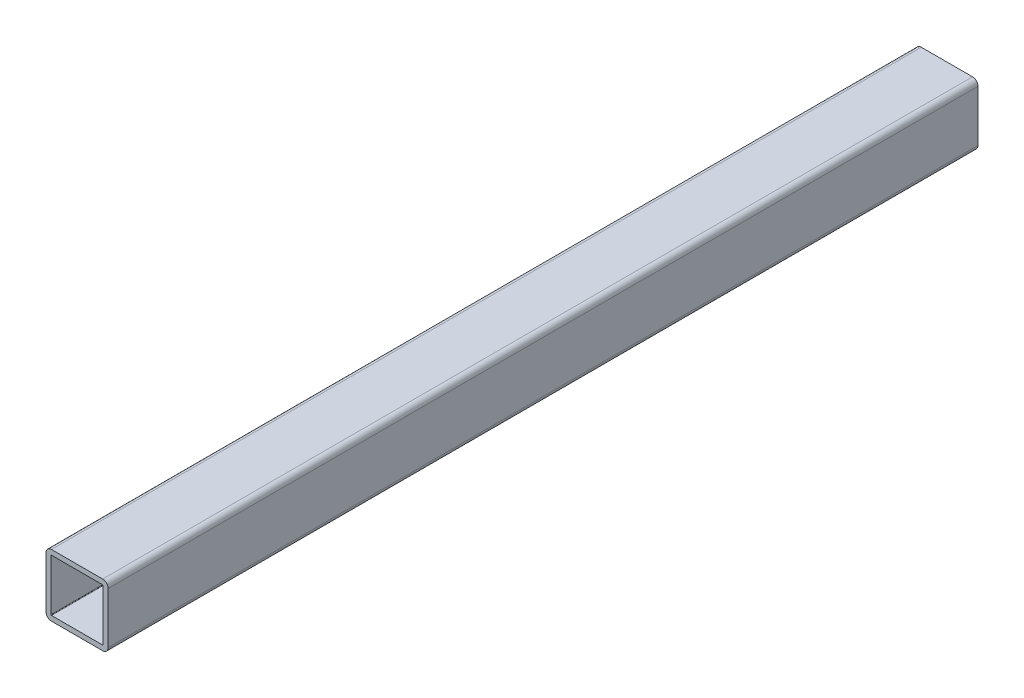
ISO-10303-21;
HEADER;
FILE_DESCRIPTION(('STEP AP214'),'2;1');
FILE_NAME('part.step','',(''),(''),'','','');
FILE_SCHEMA(('AUTOMOTIVE_DESIGN { 1 0 10303 214 1 1 1 1 }'));
ENDSEC;
DATA;
#1=APPLICATION_CONTEXT('core data for automotive mechanical design processes');
#2=APPLICATION_PROTOCOL_DEFINITION('international standard','automotive_design',2000,#1);
#3=PRODUCT_CONTEXT('',#1,'mechanical');
#4=PRODUCT('Part','Part','',(#3));
#5=PRODUCT_RELATED_PRODUCT_CATEGORY('part','',(#4));
#6=PRODUCT_DEFINITION_FORMATION('','',#4);
#7=PRODUCT_DEFINITION_CONTEXT('part definition',#1,'design');
#8=PRODUCT_DEFINITION('design','',#6,#7);
#9=PRODUCT_DEFINITION_SHAPE('','',#8);
#10=(LENGTH_UNIT() NAMED_UNIT(*) SI_UNIT(.MILLI.,.METRE.));
#11=(NAMED_UNIT(*) PLANE_ANGLE_UNIT() SI_UNIT($,.RADIAN.));
#12=(NAMED_UNIT(*) SI_UNIT($,.STERADIAN.) SOLID_ANGLE_UNIT());
#13=UNCERTAINTY_MEASURE_WITH_UNIT(LENGTH_MEASURE(1.E-05),#10,'distance_accuracy_value','');
#14=(GEOMETRIC_REPRESENTATION_CONTEXT(3) GLOBAL_UNCERTAINTY_ASSIGNED_CONTEXT((#13)) GLOBAL_UNIT_ASSIGNED_CONTEXT((#10,
#11,#12)) REPRESENTATION_CONTEXT('',''));
#15=CARTESIAN_POINT('',(0.,0.,0.));
#16=DIRECTION('',(0.,0.,1.));
#17=DIRECTION('',(1.,0.,0.));
#18=AXIS2_PLACEMENT_3D('',#15,#16,#17);
#19=CARTESIAN_POINT('',(-10.3,10.3,-350.));
#20=DIRECTION('',(0.,0.,1.));
#21=DIRECTION('',(1.,0.,0.));
#22=AXIS2_PLACEMENT_3D('',#19,#20,#21);
#23=CYLINDRICAL_SURFACE('',#22,2.2);
#24=CARTESIAN_POINT('',(-10.3,10.3,0.));
#25=DIRECTION('',(0.,0.,-1.));
#26=DIRECTION('',(-1.,0.,0.));
#27=AXIS2_PLACEMENT_3D('',#24,#25,#26);
#28=CIRCLE('',#27,2.2);
#29=CARTESIAN_POINT('',(-12.5,10.3,0.));
#30=VERTEX_POINT('',#29);
#31=CARTESIAN_POINT('',(-10.3,12.5,0.));
#32=VERTEX_POINT('',#31);
#33=EDGE_CURVE('E235',#30,#32,#28,.T.);
#34=ORIENTED_EDGE('',*,*,#33,.T.);
#35=DIRECTION('',(0.,0.,1.));
#36=VECTOR('',#35,1.);
#37=CARTESIAN_POINT('',(-10.3,12.5,-350.));
#38=LINE('',#37,#36);
#39=CARTESIAN_POINT('',(-10.3,12.5,-350.));
#40=VERTEX_POINT('',#39);
#41=EDGE_CURVE('E12',#40,#32,#38,.T.);
#42=ORIENTED_EDGE('',*,*,#41,.F.);
#43=CARTESIAN_POINT('',(-10.3,10.3,-350.));
#44=DIRECTION('',(0.,0.,-1.));
#45=DIRECTION('',(-1.,0.,0.));
#46=AXIS2_PLACEMENT_3D('',#43,#44,#45);
#47=CIRCLE('',#46,2.2);
#48=CARTESIAN_POINT('',(-12.5,10.3,-350.));
#49=VERTEX_POINT('',#48);
#50=EDGE_CURVE('E313',#49,#40,#47,.T.);
#51=ORIENTED_EDGE('',*,*,#50,.F.);
#52=DIRECTION('',(0.,0.,1.));
#53=VECTOR('',#52,1.);
#54=CARTESIAN_POINT('',(-12.5,10.3,-350.));
#55=LINE('',#54,#53);
#56=EDGE_CURVE('E250',#49,#30,#55,.T.);
#57=ORIENTED_EDGE('',*,*,#56,.T.);
#58=EDGE_LOOP('',(#34,#42,#51,#57));
#59=FACE_BOUND('',#58,.T.);
#60=ADVANCED_FACE('F63',(#59),#23,.T.);
#61=CARTESIAN_POINT('',(-10.3,12.5,-350.));
#62=DIRECTION('',(0.,-1.,0.));
#63=DIRECTION('',(0.,0.,-1.));
#64=AXIS2_PLACEMENT_3D('',#61,#62,#63);
#65=PLANE('',#64);
#66=DIRECTION('',(1.,0.,0.));
#67=VECTOR('',#66,1.);
#68=CARTESIAN_POINT('',(-10.3,12.5,0.));
#69=LINE('',#68,#67);
#70=CARTESIAN_POINT('',(10.3,12.5,0.));
#71=VERTEX_POINT('',#70);
#72=EDGE_CURVE('E238',#32,#71,#69,.T.);
#73=ORIENTED_EDGE('',*,*,#72,.T.);
#74=DIRECTION('',(0.,0.,1.));
#75=VECTOR('',#74,1.);
#76=CARTESIAN_POINT('',(10.3,12.5,-350.));
#77=LINE('',#76,#75);
#78=CARTESIAN_POINT('',(10.3,12.5,-350.));
#79=VERTEX_POINT('',#78);
#80=EDGE_CURVE('E73',#79,#71,#77,.T.);
#81=ORIENTED_EDGE('',*,*,#80,.F.);
#82=DIRECTION('',(1.,0.,0.));
#83=VECTOR('',#82,1.);
#84=CARTESIAN_POINT('',(-10.3,12.5,-350.));
#85=LINE('',#84,#83);
#86=EDGE_CURVE('E315',#40,#79,#85,.T.);
#87=ORIENTED_EDGE('',*,*,#86,.F.);
#88=ORIENTED_EDGE('',*,*,#41,.T.);
#89=EDGE_LOOP('',(#73,#81,#87,#88));
#90=FACE_BOUND('',#89,.T.);
#91=ADVANCED_FACE('F350',(#90),#65,.F.);
#92=CARTESIAN_POINT('',(10.3,10.3,-350.));
#93=DIRECTION('',(0.,0.,1.));
#94=DIRECTION('',(1.,0.,0.));
#95=AXIS2_PLACEMENT_3D('',#92,#93,#94);
#96=CYLINDRICAL_SURFACE('',#95,2.2);
#97=CARTESIAN_POINT('',(10.3,10.3,0.));
#98=DIRECTION('',(0.,0.,-1.));
#99=DIRECTION('',(-1.,0.,0.));
#100=AXIS2_PLACEMENT_3D('',#97,#98,#99);
#101=CIRCLE('',#100,2.2);
#102=CARTESIAN_POINT('',(12.5,10.3,0.));
#103=VERTEX_POINT('',#102);
#104=EDGE_CURVE('E240',#71,#103,#101,.T.);
#105=ORIENTED_EDGE('',*,*,#104,.T.);
#106=DIRECTION('',(0.,0.,1.));
#107=VECTOR('',#106,1.);
#108=CARTESIAN_POINT('',(12.5,10.3,-350.));
#109=LINE('',#108,#107);
#110=CARTESIAN_POINT('',(12.5,10.3,-350.));
#111=VERTEX_POINT('',#110);
#112=EDGE_CURVE('E257',#111,#103,#109,.T.);
#113=ORIENTED_EDGE('',*,*,#112,.F.);
#114=CARTESIAN_POINT('',(10.3,10.3,-350.));
#115=DIRECTION('',(0.,0.,-1.));
#116=DIRECTION('',(-1.,0.,0.));
#117=AXIS2_PLACEMENT_3D('',#114,#115,#116);
#118=CIRCLE('',#117,2.2);
#119=EDGE_CURVE('E317',#79,#111,#118,.T.);
#120=ORIENTED_EDGE('',*,*,#119,.F.);
#121=ORIENTED_EDGE('',*,*,#80,.T.);
#122=EDGE_LOOP('',(#105,#113,#120,#121));
#123=FACE_BOUND('',#122,.T.);
#124=ADVANCED_FACE('F355',(#123),#96,.T.);
#125=CARTESIAN_POINT('',(12.5,-10.3,-350.));
#126=DIRECTION('',(-1.,0.,0.));
#127=DIRECTION('',(0.,0.,1.));
#128=AXIS2_PLACEMENT_3D('',#125,#126,#127);
#129=PLANE('',#128);
#130=DIRECTION('',(0.,-1.,0.));
#131=VECTOR('',#130,1.);
#132=CARTESIAN_POINT('',(12.5,-10.3,0.));
#133=LINE('',#132,#131);
#134=CARTESIAN_POINT('',(12.5,-10.3,0.));
#135=VERTEX_POINT('',#134);
#136=EDGE_CURVE('E242',#103,#135,#133,.T.);
#137=ORIENTED_EDGE('',*,*,#136,.T.);
#138=DIRECTION('',(0.,0.,1.));
#139=VECTOR('',#138,1.);
#140=CARTESIAN_POINT('',(12.5,-10.3,-350.));
#141=LINE('',#140,#139);
#142=CARTESIAN_POINT('',(12.5,-10.3,-350.));
#143=VERTEX_POINT('',#142);
#144=EDGE_CURVE('E254',#143,#135,#141,.T.);
#145=ORIENTED_EDGE('',*,*,#144,.F.);
#146=DIRECTION('',(0.,-1.,0.));
#147=VECTOR('',#146,1.);
#148=CARTESIAN_POINT('',(12.5,-10.3,-350.));
#149=LINE('',#148,#147);
#150=EDGE_CURVE('E319',#111,#143,#149,.T.);
#151=ORIENTED_EDGE('',*,*,#150,.F.);
#152=ORIENTED_EDGE('',*,*,#112,.T.);
#153=EDGE_LOOP('',(#137,#145,#151,#152));
#154=FACE_BOUND('',#153,.T.);
#155=ADVANCED_FACE('F325',(#154),#129,.F.);
#156=CARTESIAN_POINT('',(10.3,-10.3,-350.));
#157=DIRECTION('',(0.,0.,1.));
#158=DIRECTION('',(1.,0.,0.));
#159=AXIS2_PLACEMENT_3D('',#156,#157,#158);
#160=CYLINDRICAL_SURFACE('',#159,2.2);
#161=CARTESIAN_POINT('',(10.3,-10.3,0.));
#162=DIRECTION('',(0.,0.,-1.));
#163=DIRECTION('',(-1.,0.,0.));
#164=AXIS2_PLACEMENT_3D('',#161,#162,#163);
#165=CIRCLE('',#164,2.2);
#166=CARTESIAN_POINT('',(10.3,-12.5,0.));
#167=VERTEX_POINT('',#166);
#168=EDGE_CURVE('E244',#135,#167,#165,.T.);
#169=ORIENTED_EDGE('',*,*,#168,.T.);
#170=DIRECTION('',(0.,0.,1.));
#171=VECTOR('',#170,1.);
#172=CARTESIAN_POINT('',(10.3,-12.5,-350.));
#173=LINE('',#172,#171);
#174=CARTESIAN_POINT('',(10.3,-12.5,-350.));
#175=VERTEX_POINT('',#174);
#176=EDGE_CURVE('E202',#175,#167,#173,.T.);
#177=ORIENTED_EDGE('',*,*,#176,.F.);
#178=CARTESIAN_POINT('',(10.3,-10.3,-350.));
#179=DIRECTION('',(0.,0.,-1.));
#180=DIRECTION('',(-1.,0.,0.));
#181=AXIS2_PLACEMENT_3D('',#178,#179,#180);
#182=CIRCLE('',#181,2.2);
#183=EDGE_CURVE('E193',#143,#175,#182,.T.);
#184=ORIENTED_EDGE('',*,*,#183,.F.);
#185=ORIENTED_EDGE('',*,*,#144,.T.);
#186=EDGE_LOOP('',(#169,#177,#184,#185));
#187=FACE_BOUND('',#186,.T.);
#188=ADVANCED_FACE('F329',(#187),#160,.T.);
#189=CARTESIAN_POINT('',(10.3,-12.5,-350.));
#190=DIRECTION('',(0.,1.,0.));
#191=DIRECTION('',(0.,0.,1.));
#192=AXIS2_PLACEMENT_3D('',#189,#190,#191);
#193=PLANE('',#192);
#194=DIRECTION('',(-1.,0.,0.));
#195=VECTOR('',#194,1.);
#196=CARTESIAN_POINT('',(10.3,-12.5,0.));
#197=LINE('',#196,#195);
#198=CARTESIAN_POINT('',(-10.3,-12.5,0.));
#199=VERTEX_POINT('',#198);
#200=EDGE_CURVE('E201',#167,#199,#197,.T.);
#201=ORIENTED_EDGE('',*,*,#200,.T.);
#202=DIRECTION('',(0.,0.,1.));
#203=VECTOR('',#202,1.);
#204=CARTESIAN_POINT('',(-10.3,-12.5,-350.));
#205=LINE('',#204,#203);
#206=CARTESIAN_POINT('',(-10.3,-12.5,-350.));
#207=VERTEX_POINT('',#206);
#208=EDGE_CURVE('E198',#207,#199,#205,.T.);
#209=ORIENTED_EDGE('',*,*,#208,.F.);
#210=DIRECTION('',(-1.,0.,0.));
#211=VECTOR('',#210,1.);
#212=CARTESIAN_POINT('',(10.3,-12.5,-350.));
#213=LINE('',#212,#211);
#214=EDGE_CURVE('E187',#175,#207,#213,.T.);
#215=ORIENTED_EDGE('',*,*,#214,.F.);
#216=ORIENTED_EDGE('',*,*,#176,.T.);
#217=EDGE_LOOP('',(#201,#209,#215,#216));
#218=FACE_BOUND('',#217,.T.);
#219=ADVANCED_FACE('F199',(#218),#193,.F.);
#220=CARTESIAN_POINT('',(-10.3,-10.3,-350.));
#221=DIRECTION('',(0.,0.,1.));
#222=DIRECTION('',(1.,0.,0.));
#223=AXIS2_PLACEMENT_3D('',#220,#221,#222);
#224=CYLINDRICAL_SURFACE('',#223,2.2);
#225=CARTESIAN_POINT('',(-10.3,-10.3,0.));
#226=DIRECTION('',(0.,0.,-1.));
#227=DIRECTION('',(-1.,0.,0.));
#228=AXIS2_PLACEMENT_3D('',#225,#226,#227);
#229=CIRCLE('',#228,2.2);
#230=CARTESIAN_POINT('',(-12.5,-10.3,0.));
#231=VERTEX_POINT('',#230);
#232=EDGE_CURVE('E135',#199,#231,#229,.T.);
#233=ORIENTED_EDGE('',*,*,#232,.T.);
#234=DIRECTION('',(0.,0.,1.));
#235=VECTOR('',#234,1.);
#236=CARTESIAN_POINT('',(-12.5,-10.3,-350.));
#237=LINE('',#236,#235);
#238=CARTESIAN_POINT('',(-12.5,-10.3,-350.));
#239=VERTEX_POINT('',#238);
#240=EDGE_CURVE('E203',#239,#231,#237,.T.);
#241=ORIENTED_EDGE('',*,*,#240,.F.);
#242=CARTESIAN_POINT('',(-10.3,-10.3,-350.));
#243=DIRECTION('',(0.,0.,-1.));
#244=DIRECTION('',(-1.,0.,0.));
#245=AXIS2_PLACEMENT_3D('',#242,#243,#244);
#246=CIRCLE('',#245,2.2);
#247=EDGE_CURVE('E191',#207,#239,#246,.T.);
#248=ORIENTED_EDGE('',*,*,#247,.F.);
#249=ORIENTED_EDGE('',*,*,#208,.T.);
#250=EDGE_LOOP('',(#233,#241,#248,#249));
#251=FACE_BOUND('',#250,.T.);
#252=ADVANCED_FACE('F205',(#251),#224,.T.);
#253=CARTESIAN_POINT('',(10.3,10.3,-350.));
#254=DIRECTION('',(0.,0.,1.));
#255=DIRECTION('',(1.,0.,0.));
#256=AXIS2_PLACEMENT_3D('',#253,#254,#255);
#257=CYLINDRICAL_SURFACE('',#256,0.200000000000001);
#258=CARTESIAN_POINT('',(10.3,10.3,0.));
#259=DIRECTION('',(0.,0.,-1.));
#260=DIRECTION('',(-1.,0.,0.));
#261=AXIS2_PLACEMENT_3D('',#258,#259,#260);
#262=CIRCLE('',#261,0.200000000000001);
#263=CARTESIAN_POINT('',(10.3,10.5,0.));
#264=VERTEX_POINT('',#263);
#265=CARTESIAN_POINT('',(10.5,10.3,0.));
#266=VERTEX_POINT('',#265);
#267=EDGE_CURVE('E211',#264,#266,#262,.T.);
#268=ORIENTED_EDGE('',*,*,#267,.F.);
#269=DIRECTION('',(0.,0.,1.));
#270=VECTOR('',#269,1.);
#271=CARTESIAN_POINT('',(10.3,10.5,-350.));
#272=LINE('',#271,#270);
#273=CARTESIAN_POINT('',(10.3,10.5,-350.));
#274=VERTEX_POINT('',#273);
#275=EDGE_CURVE('E67',#274,#264,#272,.T.);
#276=ORIENTED_EDGE('',*,*,#275,.F.);
#277=CARTESIAN_POINT('',(10.3,10.3,-350.));
#278=DIRECTION('',(0.,0.,-1.));
#279=DIRECTION('',(-1.,0.,0.));
#280=AXIS2_PLACEMENT_3D('',#277,#278,#279);
#281=CIRCLE('',#280,0.200000000000001);
#282=CARTESIAN_POINT('',(10.5,10.3,-350.));
#283=VERTEX_POINT('',#282);
#284=EDGE_CURVE('E249',#274,#283,#281,.T.);
#285=ORIENTED_EDGE('',*,*,#284,.T.);
#286=DIRECTION('',(0.,0.,1.));
#287=VECTOR('',#286,1.);
#288=CARTESIAN_POINT('',(10.5,10.3,-350.));
#289=LINE('',#288,#287);
#290=EDGE_CURVE('E207',#283,#266,#289,.T.);
#291=ORIENTED_EDGE('',*,*,#290,.T.);
#292=EDGE_LOOP('',(#268,#276,#285,#291));
#293=FACE_BOUND('',#292,.T.);
#294=ADVANCED_FACE('F65',(#293),#257,.F.);
#295=CARTESIAN_POINT('',(-10.3,10.5,-350.));
#296=DIRECTION('',(0.,-1.,0.));
#297=DIRECTION('',(0.,0.,-1.));
#298=AXIS2_PLACEMENT_3D('',#295,#296,#297);
#299=PLANE('',#298);
#300=DIRECTION('',(1.,0.,0.));
#301=VECTOR('',#300,1.);
#302=CARTESIAN_POINT('',(-10.3,10.5,0.));
#303=LINE('',#302,#301);
#304=CARTESIAN_POINT('',(-10.3,10.5,0.));
#305=VERTEX_POINT('',#304);
#306=EDGE_CURVE('E214',#305,#264,#303,.T.);
#307=ORIENTED_EDGE('',*,*,#306,.F.);
#308=DIRECTION('',(0.,0.,1.));
#309=VECTOR('',#308,1.);
#310=CARTESIAN_POINT('',(-10.3,10.5,-350.));
#311=LINE('',#310,#309);
#312=CARTESIAN_POINT('',(-10.3,10.5,-350.));
#313=VERTEX_POINT('',#312);
#314=EDGE_CURVE('E272',#313,#305,#311,.T.);
#315=ORIENTED_EDGE('',*,*,#314,.F.);
#316=DIRECTION('',(1.,0.,0.));
#317=VECTOR('',#316,1.);
#318=CARTESIAN_POINT('',(-10.3,10.5,-350.));
#319=LINE('',#318,#317);
#320=EDGE_CURVE('E281',#313,#274,#319,.T.);
#321=ORIENTED_EDGE('',*,*,#320,.T.);
#322=ORIENTED_EDGE('',*,*,#275,.T.);
#323=EDGE_LOOP('',(#307,#315,#321,#322));
#324=FACE_BOUND('',#323,.T.);
#325=ADVANCED_FACE('F279',(#324),#299,.T.);
#326=CARTESIAN_POINT('',(-10.3,10.3,-350.));
#327=DIRECTION('',(0.,0.,1.));
#328=DIRECTION('',(1.,0.,0.));
#329=AXIS2_PLACEMENT_3D('',#326,#327,#328);
#330=CYLINDRICAL_SURFACE('',#329,0.2);
#331=CARTESIAN_POINT('',(-10.3,10.3,0.));
#332=DIRECTION('',(0.,0.,-1.));
#333=DIRECTION('',(-1.,0.,0.));
#334=AXIS2_PLACEMENT_3D('',#331,#332,#333);
#335=CIRCLE('',#334,0.2);
#336=CARTESIAN_POINT('',(-10.5,10.3,0.));
#337=VERTEX_POINT('',#336);
#338=EDGE_CURVE('E217',#337,#305,#335,.T.);
#339=ORIENTED_EDGE('',*,*,#338,.F.);
#340=DIRECTION('',(0.,0.,1.));
#341=VECTOR('',#340,1.);
#342=CARTESIAN_POINT('',(-10.5,10.3,-350.));
#343=LINE('',#342,#341);
#344=CARTESIAN_POINT('',(-10.5,10.3,-350.));
#345=VERTEX_POINT('',#344);
#346=EDGE_CURVE('E271',#345,#337,#343,.T.);
#347=ORIENTED_EDGE('',*,*,#346,.F.);
#348=CARTESIAN_POINT('',(-10.3,10.3,-350.));
#349=DIRECTION('',(0.,0.,-1.));
#350=DIRECTION('',(-1.,0.,0.));
#351=AXIS2_PLACEMENT_3D('',#348,#349,#350);
#352=CIRCLE('',#351,0.2);
#353=EDGE_CURVE('E289',#345,#313,#352,.T.);
#354=ORIENTED_EDGE('',*,*,#353,.T.);
#355=ORIENTED_EDGE('',*,*,#314,.T.);
#356=EDGE_LOOP('',(#339,#347,#354,#355));
#357=FACE_BOUND('',#356,.T.);
#358=ADVANCED_FACE('F287',(#357),#330,.F.);
#359=CARTESIAN_POINT('',(-10.5,10.3,-350.));
#360=DIRECTION('',(1.,0.,0.));
#361=DIRECTION('',(0.,0.,-1.));
#362=AXIS2_PLACEMENT_3D('',#359,#360,#361);
#363=PLANE('',#362);
#364=DIRECTION('',(0.,1.,0.));
#365=VECTOR('',#364,1.);
#366=CARTESIAN_POINT('',(-10.5,10.3,0.));
#367=LINE('',#366,#365);
#368=CARTESIAN_POINT('',(-10.5,-10.3,0.));
#369=VERTEX_POINT('',#368);
#370=EDGE_CURVE('E220',#369,#337,#367,.T.);
#371=ORIENTED_EDGE('',*,*,#370,.F.);
#372=DIRECTION('',(0.,0.,1.));
#373=VECTOR('',#372,1.);
#374=CARTESIAN_POINT('',(-10.5,-10.3,-350.));
#375=LINE('',#374,#373);
#376=CARTESIAN_POINT('',(-10.5,-10.3,-350.));
#377=VERTEX_POINT('',#376);
#378=EDGE_CURVE('E269',#377,#369,#375,.T.);
#379=ORIENTED_EDGE('',*,*,#378,.F.);
#380=DIRECTION('',(0.,1.,0.));
#381=VECTOR('',#380,1.);
#382=CARTESIAN_POINT('',(-10.5,10.3,-350.));
#383=LINE('',#382,#381);
#384=EDGE_CURVE('E295',#377,#345,#383,.T.);
#385=ORIENTED_EDGE('',*,*,#384,.T.);
#386=ORIENTED_EDGE('',*,*,#346,.T.);
#387=EDGE_LOOP('',(#371,#379,#385,#386));
#388=FACE_BOUND('',#387,.T.);
#389=ADVANCED_FACE('F298',(#388),#363,.T.);
#390=CARTESIAN_POINT('',(-10.3,-10.3,-350.));
#391=DIRECTION('',(0.,0.,1.));
#392=DIRECTION('',(1.,0.,0.));
#393=AXIS2_PLACEMENT_3D('',#390,#391,#392);
#394=CYLINDRICAL_SURFACE('',#393,0.2);
#395=CARTESIAN_POINT('',(-10.3,-10.3,0.));
#396=DIRECTION('',(0.,0.,-1.));
#397=DIRECTION('',(-1.,0.,0.));
#398=AXIS2_PLACEMENT_3D('',#395,#396,#397);
#399=CIRCLE('',#398,0.2);
#400=CARTESIAN_POINT('',(-10.3,-10.5,0.));
#401=VERTEX_POINT('',#400);
#402=EDGE_CURVE('E223',#401,#369,#399,.T.);
#403=ORIENTED_EDGE('',*,*,#402,.F.);
#404=DIRECTION('',(0.,0.,1.));
#405=VECTOR('',#404,1.);
#406=CARTESIAN_POINT('',(-10.3,-10.5,-350.));
#407=LINE('',#406,#405);
#408=CARTESIAN_POINT('',(-10.3,-10.5,-350.));
#409=VERTEX_POINT('',#408);
#410=EDGE_CURVE('E267',#409,#401,#407,.T.);
#411=ORIENTED_EDGE('',*,*,#410,.F.);
#412=CARTESIAN_POINT('',(-10.3,-10.3,-350.));
#413=DIRECTION('',(0.,0.,-1.));
#414=DIRECTION('',(-1.,0.,0.));
#415=AXIS2_PLACEMENT_3D('',#412,#413,#414);
#416=CIRCLE('',#415,0.2);
#417=EDGE_CURVE('E299',#409,#377,#416,.T.);
#418=ORIENTED_EDGE('',*,*,#417,.T.);
#419=ORIENTED_EDGE('',*,*,#378,.T.);
#420=EDGE_LOOP('',(#403,#411,#418,#419));
#421=FACE_BOUND('',#420,.T.);
#422=ADVANCED_FACE('F366',(#421),#394,.F.);
#423=CARTESIAN_POINT('',(10.3,-10.5,-350.));
#424=DIRECTION('',(0.,1.,0.));
#425=DIRECTION('',(0.,0.,1.));
#426=AXIS2_PLACEMENT_3D('',#423,#424,#425);
#427=PLANE('',#426);
#428=DIRECTION('',(-1.,0.,0.));
#429=VECTOR('',#428,1.);
#430=CARTESIAN_POINT('',(10.3,-10.5,0.));
#431=LINE('',#430,#429);
#432=CARTESIAN_POINT('',(10.3,-10.5,0.));
#433=VERTEX_POINT('',#432);
#434=EDGE_CURVE('E226',#433,#401,#431,.T.);
#435=ORIENTED_EDGE('',*,*,#434,.F.);
#436=DIRECTION('',(0.,0.,1.));
#437=VECTOR('',#436,1.);
#438=CARTESIAN_POINT('',(10.3,-10.5,-350.));
#439=LINE('',#438,#437);
#440=CARTESIAN_POINT('',(10.3,-10.5,-350.));
#441=VERTEX_POINT('',#440);
#442=EDGE_CURVE('E265',#441,#433,#439,.T.);
#443=ORIENTED_EDGE('',*,*,#442,.F.);
#444=DIRECTION('',(-1.,0.,0.));
#445=VECTOR('',#444,1.);
#446=CARTESIAN_POINT('',(10.3,-10.5,-350.));
#447=LINE('',#446,#445);
#448=EDGE_CURVE('E301',#441,#409,#447,.T.);
#449=ORIENTED_EDGE('',*,*,#448,.T.);
#450=ORIENTED_EDGE('',*,*,#410,.T.);
#451=EDGE_LOOP('',(#435,#443,#449,#450));
#452=FACE_BOUND('',#451,.T.);
#453=ADVANCED_FACE('F362',(#452),#427,.T.);
#454=CARTESIAN_POINT('',(10.3,-10.3,-350.));
#455=DIRECTION('',(0.,0.,1.));
#456=DIRECTION('',(1.,0.,0.));
#457=AXIS2_PLACEMENT_3D('',#454,#455,#456);
#458=CYLINDRICAL_SURFACE('',#457,0.199999999999999);
#459=CARTESIAN_POINT('',(10.3,-10.3,0.));
#460=DIRECTION('',(0.,0.,-1.));
#461=DIRECTION('',(-1.,0.,0.));
#462=AXIS2_PLACEMENT_3D('',#459,#460,#461);
#463=CIRCLE('',#462,0.199999999999999);
#464=CARTESIAN_POINT('',(10.5,-10.3,0.));
#465=VERTEX_POINT('',#464);
#466=EDGE_CURVE('E229',#465,#433,#463,.T.);
#467=ORIENTED_EDGE('',*,*,#466,.F.);
#468=DIRECTION('',(0.,0.,1.));
#469=VECTOR('',#468,1.);
#470=CARTESIAN_POINT('',(10.5,-10.3,-350.));
#471=LINE('',#470,#469);
#472=CARTESIAN_POINT('',(10.5,-10.3,-350.));
#473=VERTEX_POINT('',#472);
#474=EDGE_CURVE('E263',#473,#465,#471,.T.);
#475=ORIENTED_EDGE('',*,*,#474,.F.);
#476=CARTESIAN_POINT('',(10.3,-10.3,-350.));
#477=DIRECTION('',(0.,0.,-1.));
#478=DIRECTION('',(-1.,0.,0.));
#479=AXIS2_PLACEMENT_3D('',#476,#477,#478);
#480=CIRCLE('',#479,0.199999999999999);
#481=EDGE_CURVE('E307',#473,#441,#480,.T.);
#482=ORIENTED_EDGE('',*,*,#481,.T.);
#483=ORIENTED_EDGE('',*,*,#442,.T.);
#484=EDGE_LOOP('',(#467,#475,#482,#483));
#485=FACE_BOUND('',#484,.T.);
#486=ADVANCED_FACE('F344',(#485),#458,.F.);
#487=CARTESIAN_POINT('',(10.5,-10.3,-350.));
#488=DIRECTION('',(-1.,0.,0.));
#489=DIRECTION('',(0.,0.,1.));
#490=AXIS2_PLACEMENT_3D('',#487,#488,#489);
#491=PLANE('',#490);
#492=DIRECTION('',(0.,-1.,0.));
#493=VECTOR('',#492,1.);
#494=CARTESIAN_POINT('',(10.5,-10.3,0.));
#495=LINE('',#494,#493);
#496=EDGE_CURVE('E232',#266,#465,#495,.T.);
#497=ORIENTED_EDGE('',*,*,#496,.F.);
#498=ORIENTED_EDGE('',*,*,#290,.F.);
#499=DIRECTION('',(0.,-1.,0.));
#500=VECTOR('',#499,1.);
#501=CARTESIAN_POINT('',(10.5,-10.3,-350.));
#502=LINE('',#501,#500);
#503=EDGE_CURVE('E310',#283,#473,#502,.T.);
#504=ORIENTED_EDGE('',*,*,#503,.T.);
#505=ORIENTED_EDGE('',*,*,#474,.T.);
#506=EDGE_LOOP('',(#497,#498,#504,#505));
#507=FACE_BOUND('',#506,.T.);
#508=ADVANCED_FACE('F337',(#507),#491,.T.);
#509=CARTESIAN_POINT('',(-12.5,10.3,-350.));
#510=DIRECTION('',(1.,0.,0.));
#511=DIRECTION('',(0.,0.,-1.));
#512=AXIS2_PLACEMENT_3D('',#509,#510,#511);
#513=PLANE('',#512);
#514=DIRECTION('',(0.,1.,0.));
#515=VECTOR('',#514,1.);
#516=CARTESIAN_POINT('',(-12.5,10.3,0.));
#517=LINE('',#516,#515);
#518=EDGE_CURVE('E141',#231,#30,#517,.T.);
#519=ORIENTED_EDGE('',*,*,#518,.T.);
#520=ORIENTED_EDGE('',*,*,#56,.F.);
#521=DIRECTION('',(0.,1.,0.));
#522=VECTOR('',#521,1.);
#523=CARTESIAN_POINT('',(-12.5,10.3,-350.));
#524=LINE('',#523,#522);
#525=EDGE_CURVE('E82',#239,#49,#524,.T.);
#526=ORIENTED_EDGE('',*,*,#525,.F.);
#527=ORIENTED_EDGE('',*,*,#240,.T.);
#528=EDGE_LOOP('',(#519,#520,#526,#527));
#529=FACE_BOUND('',#528,.T.);
#530=ADVANCED_FACE('F335',(#529),#513,.F.);
#531=CARTESIAN_POINT('',(-10.3,10.3,-350.));
#532=DIRECTION('',(0.,0.,-1.));
#533=DIRECTION('',(-1.,0.,0.));
#534=AXIS2_PLACEMENT_3D('',#531,#532,#533);
#535=PLANE('',#534);
#536=ORIENTED_EDGE('',*,*,#284,.F.);
#537=ORIENTED_EDGE('',*,*,#320,.F.);
#538=ORIENTED_EDGE('',*,*,#353,.F.);
#539=ORIENTED_EDGE('',*,*,#384,.F.);
#540=ORIENTED_EDGE('',*,*,#417,.F.);
#541=ORIENTED_EDGE('',*,*,#448,.F.);
#542=ORIENTED_EDGE('',*,*,#481,.F.);
#543=ORIENTED_EDGE('',*,*,#503,.F.);
#544=EDGE_LOOP('',(#536,#537,#538,#539,#540,#541,#542,#543));
#545=FACE_BOUND('',#544,.T.);
#546=ORIENTED_EDGE('',*,*,#50,.T.);
#547=ORIENTED_EDGE('',*,*,#86,.T.);
#548=ORIENTED_EDGE('',*,*,#119,.T.);
#549=ORIENTED_EDGE('',*,*,#150,.T.);
#550=ORIENTED_EDGE('',*,*,#183,.T.);
#551=ORIENTED_EDGE('',*,*,#214,.T.);
#552=ORIENTED_EDGE('',*,*,#247,.T.);
#553=ORIENTED_EDGE('',*,*,#525,.T.);
#554=EDGE_LOOP('',(#546,#547,#548,#549,#550,#551,#552,#553));
#555=FACE_BOUND('',#554,.T.);
#556=ADVANCED_FACE('F189',(#545,#555),#535,.T.);
#557=CARTESIAN_POINT('',(-10.3,10.3,0.));
#558=DIRECTION('',(0.,0.,-1.));
#559=DIRECTION('',(-1.,0.,0.));
#560=AXIS2_PLACEMENT_3D('',#557,#558,#559);
#561=PLANE('',#560);
#562=ORIENTED_EDGE('',*,*,#267,.T.);
#563=ORIENTED_EDGE('',*,*,#496,.T.);
#564=ORIENTED_EDGE('',*,*,#466,.T.);
#565=ORIENTED_EDGE('',*,*,#434,.T.);
#566=ORIENTED_EDGE('',*,*,#402,.T.);
#567=ORIENTED_EDGE('',*,*,#370,.T.);
#568=ORIENTED_EDGE('',*,*,#338,.T.);
#569=ORIENTED_EDGE('',*,*,#306,.T.);
#570=EDGE_LOOP('',(#562,#563,#564,#565,#566,#567,#568,#569));
#571=FACE_BOUND('',#570,.T.);
#572=ORIENTED_EDGE('',*,*,#33,.F.);
#573=ORIENTED_EDGE('',*,*,#518,.F.);
#574=ORIENTED_EDGE('',*,*,#232,.F.);
#575=ORIENTED_EDGE('',*,*,#200,.F.);
#576=ORIENTED_EDGE('',*,*,#168,.F.);
#577=ORIENTED_EDGE('',*,*,#136,.F.);
#578=ORIENTED_EDGE('',*,*,#104,.F.);
#579=ORIENTED_EDGE('',*,*,#72,.F.);
#580=EDGE_LOOP('',(#572,#573,#574,#575,#576,#577,#578,#579));
#581=FACE_BOUND('',#580,.T.);
#582=ADVANCED_FACE('F284',(#571,#581),#561,.F.);
#583=CLOSED_SHELL('',(#60,#91,#124,#155,#188,#219,#252,#294,#325,#358,#389,#422,#453,#486,#508,
#530,#556,#582));
#584=MANIFOLD_SOLID_BREP('B2',#583);
#585=ADVANCED_BREP_SHAPE_REPRESENTATION('',(#18,#584),#14);
#586=SHAPE_DEFINITION_REPRESENTATION(#9,#585);
ENDSEC;
END-ISO-10303-21;
